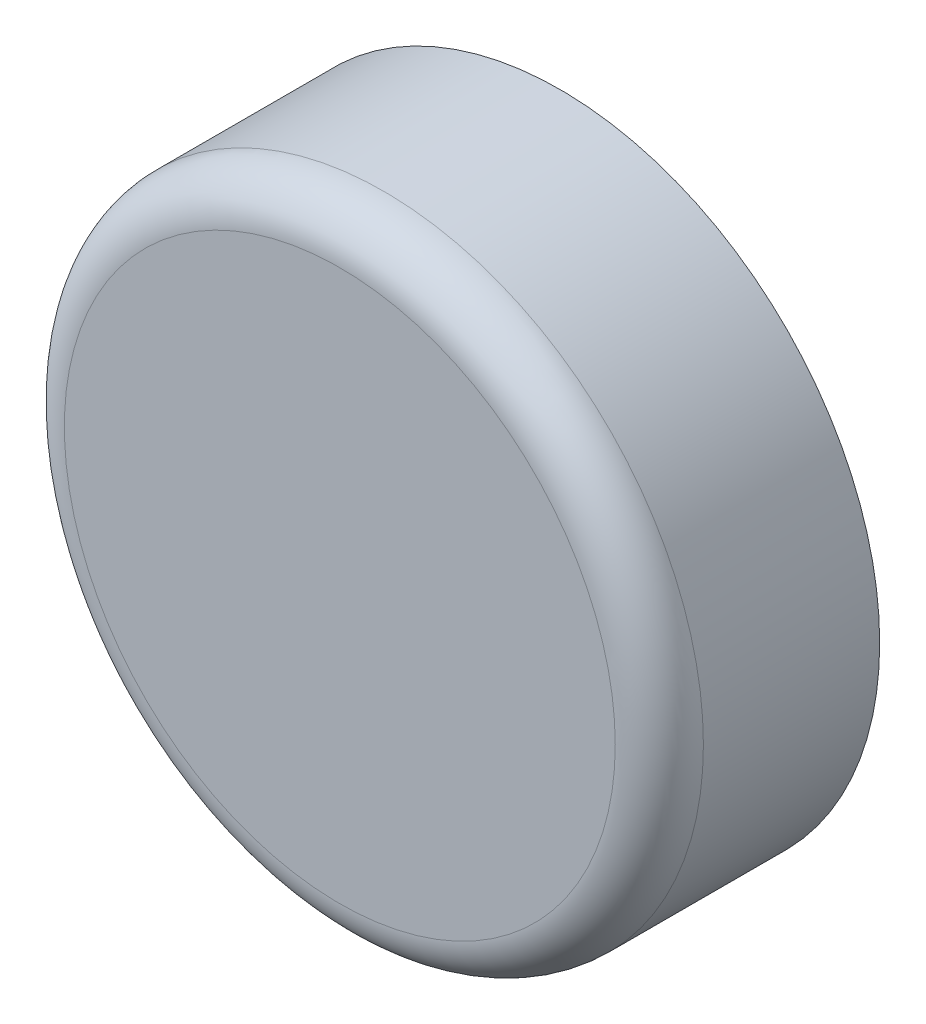
ISO-10303-21;
HEADER;
FILE_DESCRIPTION(('STEP AP214'),'2;1');
FILE_NAME('part.step','',(''),(''),'','','');
FILE_SCHEMA(('AUTOMOTIVE_DESIGN { 1 0 10303 214 1 1 1 1 }'));
ENDSEC;
DATA;
#1=APPLICATION_CONTEXT('core data for automotive mechanical design processes');
#2=APPLICATION_PROTOCOL_DEFINITION('international standard','automotive_design',2000,#1);
#3=PRODUCT_CONTEXT('',#1,'mechanical');
#4=PRODUCT('Part','Part','',(#3));
#5=PRODUCT_RELATED_PRODUCT_CATEGORY('part','',(#4));
#6=PRODUCT_DEFINITION_FORMATION('','',#4);
#7=PRODUCT_DEFINITION_CONTEXT('part definition',#1,'design');
#8=PRODUCT_DEFINITION('design','',#6,#7);
#9=PRODUCT_DEFINITION_SHAPE('','',#8);
#10=(LENGTH_UNIT() NAMED_UNIT(*) SI_UNIT(.MILLI.,.METRE.));
#11=(NAMED_UNIT(*) PLANE_ANGLE_UNIT() SI_UNIT($,.RADIAN.));
#12=(NAMED_UNIT(*) SI_UNIT($,.STERADIAN.) SOLID_ANGLE_UNIT());
#13=UNCERTAINTY_MEASURE_WITH_UNIT(LENGTH_MEASURE(1.E-05),#10,'distance_accuracy_value','');
#14=(GEOMETRIC_REPRESENTATION_CONTEXT(3) GLOBAL_UNCERTAINTY_ASSIGNED_CONTEXT((#13)) GLOBAL_UNIT_ASSIGNED_CONTEXT((#10,
#11,#12)) REPRESENTATION_CONTEXT('',''));
#15=CARTESIAN_POINT('',(0.,0.,0.));
#16=DIRECTION('',(0.,0.,1.));
#17=DIRECTION('',(1.,0.,0.));
#18=AXIS2_PLACEMENT_3D('',#15,#16,#17);
#19=CARTESIAN_POINT('',(0.,0.,24.));
#20=DIRECTION('',(0.,0.,1.));
#21=DIRECTION('',(1.,0.,0.));
#22=AXIS2_PLACEMENT_3D('',#19,#20,#21);
#23=PLANE('',#22);
#24=CARTESIAN_POINT('',(0.,0.,24.));
#25=DIRECTION('',(0.,0.,-1.));
#26=DIRECTION('',(1.,0.,0.));
#27=AXIS2_PLACEMENT_3D('',#24,#25,#26);
#28=CIRCLE('',#27,6.25);
#29=CARTESIAN_POINT('',(6.25,0.,24.));
#30=VERTEX_POINT('',#29);
#31=EDGE_CURVE('E26',#30,#30,#28,.T.);
#32=ORIENTED_EDGE('',*,*,#31,.F.);
#33=EDGE_LOOP('',(#32));
#34=FACE_BOUND('',#33,.T.);
#35=ADVANCED_FACE('F15',(#34),#23,.T.);
#36=CARTESIAN_POINT('',(0.,0.,23.));
#37=DIRECTION('',(0.,0.,1.));
#38=DIRECTION('',(1.,0.,0.));
#39=AXIS2_PLACEMENT_3D('',#36,#37,#38);
#40=TOROIDAL_SURFACE('',#39,6.25,1.);
#41=CARTESIAN_POINT('',(0.,0.,23.));
#42=DIRECTION('',(0.,0.,1.));
#43=DIRECTION('',(1.,0.,0.));
#44=AXIS2_PLACEMENT_3D('',#41,#42,#43);
#45=CIRCLE('',#44,7.25);
#46=CARTESIAN_POINT('',(7.25,0.,23.));
#47=VERTEX_POINT('',#46);
#48=EDGE_CURVE('E22',#47,#47,#45,.F.);
#49=ORIENTED_EDGE('',*,*,#48,.F.);
#50=EDGE_LOOP('',(#49));
#51=FACE_BOUND('',#50,.T.);
#52=ORIENTED_EDGE('',*,*,#31,.T.);
#53=EDGE_LOOP('',(#52));
#54=FACE_BOUND('',#53,.T.);
#55=ADVANCED_FACE('F36',(#51,#54),#40,.T.);
#56=CARTESIAN_POINT('',(0.,0.,19.));
#57=DIRECTION('',(0.,0.,1.));
#58=DIRECTION('',(1.,0.,0.));
#59=AXIS2_PLACEMENT_3D('',#56,#57,#58);
#60=PLANE('',#59);
#61=CARTESIAN_POINT('',(0.,0.,19.));
#62=DIRECTION('',(0.,0.,1.));
#63=DIRECTION('',(1.,0.,0.));
#64=AXIS2_PLACEMENT_3D('',#61,#62,#63);
#65=CIRCLE('',#64,7.25);
#66=CARTESIAN_POINT('',(7.25,0.,19.));
#67=VERTEX_POINT('',#66);
#68=EDGE_CURVE('E10',#67,#67,#65,.T.);
#69=ORIENTED_EDGE('',*,*,#68,.F.);
#70=EDGE_LOOP('',(#69));
#71=FACE_BOUND('',#70,.T.);
#72=ADVANCED_FACE('F40',(#71),#60,.F.);
#73=CARTESIAN_POINT('',(0.,0.,19.));
#74=DIRECTION('',(0.,0.,1.));
#75=DIRECTION('',(1.,0.,0.));
#76=AXIS2_PLACEMENT_3D('',#73,#74,#75);
#77=CYLINDRICAL_SURFACE('',#76,7.25);
#78=ORIENTED_EDGE('',*,*,#48,.T.);
#79=EDGE_LOOP('',(#78));
#80=FACE_BOUND('',#79,.T.);
#81=ORIENTED_EDGE('',*,*,#68,.T.);
#82=EDGE_LOOP('',(#81));
#83=FACE_BOUND('',#82,.T.);
#84=ADVANCED_FACE('F64',(#80,#83),#77,.T.);
#85=CLOSED_SHELL('',(#35,#55,#72,#84));
#86=MANIFOLD_SOLID_BREP('B1',#85);
#87=ADVANCED_BREP_SHAPE_REPRESENTATION('',(#18,#86),#14);
#88=SHAPE_DEFINITION_REPRESENTATION(#9,#87);
ENDSEC;
END-ISO-10303-21;
